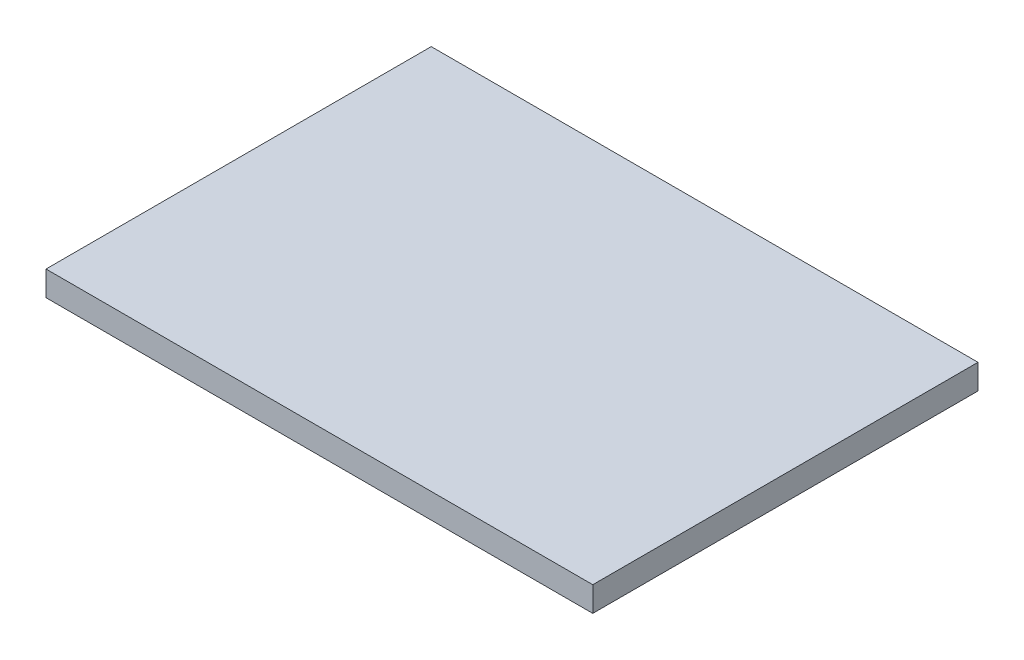
ISO-10303-21;
HEADER;
FILE_DESCRIPTION(('STEP AP214'),'2;1');
FILE_NAME('part.step','',(''),(''),'','','');
FILE_SCHEMA(('AUTOMOTIVE_DESIGN { 1 0 10303 214 1 1 1 1 }'));
ENDSEC;
DATA;
#1=APPLICATION_CONTEXT('core data for automotive mechanical design processes');
#2=APPLICATION_PROTOCOL_DEFINITION('international standard','automotive_design',2000,#1);
#3=PRODUCT_CONTEXT('',#1,'mechanical');
#4=PRODUCT('Part','Part','',(#3));
#5=PRODUCT_RELATED_PRODUCT_CATEGORY('part','',(#4));
#6=PRODUCT_DEFINITION_FORMATION('','',#4);
#7=PRODUCT_DEFINITION_CONTEXT('part definition',#1,'design');
#8=PRODUCT_DEFINITION('design','',#6,#7);
#9=PRODUCT_DEFINITION_SHAPE('','',#8);
#10=(LENGTH_UNIT() NAMED_UNIT(*) SI_UNIT(.MILLI.,.METRE.));
#11=(NAMED_UNIT(*) PLANE_ANGLE_UNIT() SI_UNIT($,.RADIAN.));
#12=(NAMED_UNIT(*) SI_UNIT($,.STERADIAN.) SOLID_ANGLE_UNIT());
#13=UNCERTAINTY_MEASURE_WITH_UNIT(LENGTH_MEASURE(1.E-05),#10,'distance_accuracy_value','');
#14=(GEOMETRIC_REPRESENTATION_CONTEXT(3) GLOBAL_UNCERTAINTY_ASSIGNED_CONTEXT((#13)) GLOBAL_UNIT_ASSIGNED_CONTEXT((#10,
#11,#12)) REPRESENTATION_CONTEXT('',''));
#15=CARTESIAN_POINT('',(0.,0.,0.));
#16=DIRECTION('',(0.,0.,1.));
#17=DIRECTION('',(1.,0.,0.));
#18=AXIS2_PLACEMENT_3D('',#15,#16,#17);
#19=CARTESIAN_POINT('',(0.,1.,0.));
#20=DIRECTION('',(1.,0.,0.));
#21=DIRECTION('',(0.,0.,-1.));
#22=AXIS2_PLACEMENT_3D('',#19,#20,#21);
#23=PLANE('',#22);
#24=DIRECTION('',(0.,-1.,0.));
#25=VECTOR('',#24,1.);
#26=CARTESIAN_POINT('',(0.,1.,15.5));
#27=LINE('',#26,#25);
#28=CARTESIAN_POINT('',(0.,1.,15.5));
#29=VERTEX_POINT('',#28);
#30=CARTESIAN_POINT('',(0.,0.,15.5));
#31=VERTEX_POINT('',#30);
#32=EDGE_CURVE('E77',#29,#31,#27,.T.);
#33=ORIENTED_EDGE('',*,*,#32,.F.);
#34=DIRECTION('',(0.,0.,-1.));
#35=VECTOR('',#34,1.);
#36=CARTESIAN_POINT('',(0.,1.,0.));
#37=LINE('',#36,#35);
#38=CARTESIAN_POINT('',(0.,1.,0.));
#39=VERTEX_POINT('',#38);
#40=EDGE_CURVE('E11',#29,#39,#37,.T.);
#41=ORIENTED_EDGE('',*,*,#40,.T.);
#42=DIRECTION('',(0.,-1.,0.));
#43=VECTOR('',#42,1.);
#44=CARTESIAN_POINT('',(0.,1.,0.));
#45=LINE('',#44,#43);
#46=CARTESIAN_POINT('',(0.,0.,0.));
#47=VERTEX_POINT('',#46);
#48=EDGE_CURVE('E95',#39,#47,#45,.T.);
#49=ORIENTED_EDGE('',*,*,#48,.T.);
#50=DIRECTION('',(0.,0.,1.));
#51=VECTOR('',#50,1.);
#52=CARTESIAN_POINT('',(0.,0.,0.));
#53=LINE('',#52,#51);
#54=EDGE_CURVE('E90',#47,#31,#53,.T.);
#55=ORIENTED_EDGE('',*,*,#54,.T.);
#56=EDGE_LOOP('',(#33,#41,#49,#55));
#57=FACE_BOUND('',#56,.T.);
#58=ADVANCED_FACE('F38',(#57),#23,.F.);
#59=CARTESIAN_POINT('',(0.,1.,15.5));
#60=DIRECTION('',(0.,0.,-1.));
#61=DIRECTION('',(-1.,0.,0.));
#62=AXIS2_PLACEMENT_3D('',#59,#60,#61);
#63=PLANE('',#62);
#64=DIRECTION('',(0.,-1.,0.));
#65=VECTOR('',#64,1.);
#66=CARTESIAN_POINT('',(22.,1.,15.5));
#67=LINE('',#66,#65);
#68=CARTESIAN_POINT('',(22.,1.,15.5));
#69=VERTEX_POINT('',#68);
#70=CARTESIAN_POINT('',(22.,0.,15.5));
#71=VERTEX_POINT('',#70);
#72=EDGE_CURVE('E84',#69,#71,#67,.T.);
#73=ORIENTED_EDGE('',*,*,#72,.F.);
#74=DIRECTION('',(-1.,0.,0.));
#75=VECTOR('',#74,1.);
#76=CARTESIAN_POINT('',(0.,1.,15.5));
#77=LINE('',#76,#75);
#78=EDGE_CURVE('E45',#69,#29,#77,.T.);
#79=ORIENTED_EDGE('',*,*,#78,.T.);
#80=ORIENTED_EDGE('',*,*,#32,.T.);
#81=DIRECTION('',(1.,0.,0.));
#82=VECTOR('',#81,1.);
#83=CARTESIAN_POINT('',(0.,0.,15.5));
#84=LINE('',#83,#82);
#85=EDGE_CURVE('E80',#31,#71,#84,.T.);
#86=ORIENTED_EDGE('',*,*,#85,.T.);
#87=EDGE_LOOP('',(#73,#79,#80,#86));
#88=FACE_BOUND('',#87,.T.);
#89=ADVANCED_FACE('F79',(#88),#63,.F.);
#90=CARTESIAN_POINT('',(22.,1.,0.));
#91=DIRECTION('',(-1.,0.,0.));
#92=DIRECTION('',(0.,0.,1.));
#93=AXIS2_PLACEMENT_3D('',#90,#91,#92);
#94=PLANE('',#93);
#95=DIRECTION('',(0.,-1.,0.));
#96=VECTOR('',#95,1.);
#97=CARTESIAN_POINT('',(22.,1.,0.));
#98=LINE('',#97,#96);
#99=CARTESIAN_POINT('',(22.,1.,0.));
#100=VERTEX_POINT('',#99);
#101=CARTESIAN_POINT('',(22.,0.,0.));
#102=VERTEX_POINT('',#101);
#103=EDGE_CURVE('E105',#100,#102,#98,.T.);
#104=ORIENTED_EDGE('',*,*,#103,.F.);
#105=DIRECTION('',(0.,0.,1.));
#106=VECTOR('',#105,1.);
#107=CARTESIAN_POINT('',(22.,1.,0.));
#108=LINE('',#107,#106);
#109=EDGE_CURVE('E59',#100,#69,#108,.T.);
#110=ORIENTED_EDGE('',*,*,#109,.T.);
#111=ORIENTED_EDGE('',*,*,#72,.T.);
#112=DIRECTION('',(0.,0.,-1.));
#113=VECTOR('',#112,1.);
#114=CARTESIAN_POINT('',(22.,0.,0.));
#115=LINE('',#114,#113);
#116=EDGE_CURVE('E92',#71,#102,#115,.T.);
#117=ORIENTED_EDGE('',*,*,#116,.T.);
#118=EDGE_LOOP('',(#104,#110,#111,#117));
#119=FACE_BOUND('',#118,.T.);
#120=ADVANCED_FACE('F108',(#119),#94,.F.);
#121=CARTESIAN_POINT('',(0.,1.,0.));
#122=DIRECTION('',(0.,0.,1.));
#123=DIRECTION('',(1.,0.,0.));
#124=AXIS2_PLACEMENT_3D('',#121,#122,#123);
#125=PLANE('',#124);
#126=ORIENTED_EDGE('',*,*,#48,.F.);
#127=DIRECTION('',(-1.,0.,0.));
#128=VECTOR('',#127,1.);
#129=CARTESIAN_POINT('',(0.,1.,0.));
#130=LINE('',#129,#128);
#131=EDGE_CURVE('E99',#100,#39,#130,.T.);
#132=ORIENTED_EDGE('',*,*,#131,.F.);
#133=ORIENTED_EDGE('',*,*,#103,.T.);
#134=DIRECTION('',(-1.,0.,0.));
#135=VECTOR('',#134,1.);
#136=CARTESIAN_POINT('',(0.,0.,0.));
#137=LINE('',#136,#135);
#138=EDGE_CURVE('E102',#102,#47,#137,.T.);
#139=ORIENTED_EDGE('',*,*,#138,.T.);
#140=EDGE_LOOP('',(#126,#132,#133,#139));
#141=FACE_BOUND('',#140,.T.);
#142=ADVANCED_FACE('F110',(#141),#125,.F.);
#143=CARTESIAN_POINT('',(0.,0.,0.));
#144=DIRECTION('',(0.,1.,0.));
#145=DIRECTION('',(0.,0.,1.));
#146=AXIS2_PLACEMENT_3D('',#143,#144,#145);
#147=PLANE('',#146);
#148=ORIENTED_EDGE('',*,*,#54,.F.);
#149=ORIENTED_EDGE('',*,*,#138,.F.);
#150=ORIENTED_EDGE('',*,*,#116,.F.);
#151=ORIENTED_EDGE('',*,*,#85,.F.);
#152=EDGE_LOOP('',(#148,#149,#150,#151));
#153=FACE_BOUND('',#152,.T.);
#154=ADVANCED_FACE('F88',(#153),#147,.F.);
#155=CARTESIAN_POINT('',(0.,1.,0.));
#156=DIRECTION('',(0.,1.,0.));
#157=DIRECTION('',(0.,0.,1.));
#158=AXIS2_PLACEMENT_3D('',#155,#156,#157);
#159=PLANE('',#158);
#160=ORIENTED_EDGE('',*,*,#131,.T.);
#161=ORIENTED_EDGE('',*,*,#40,.F.);
#162=ORIENTED_EDGE('',*,*,#78,.F.);
#163=ORIENTED_EDGE('',*,*,#109,.F.);
#164=EDGE_LOOP('',(#160,#161,#162,#163));
#165=FACE_BOUND('',#164,.T.);
#166=ADVANCED_FACE('F112',(#165),#159,.T.);
#167=CLOSED_SHELL('',(#58,#89,#120,#142,#154,#166));
#168=MANIFOLD_SOLID_BREP('B2',#167);
#169=ADVANCED_BREP_SHAPE_REPRESENTATION('',(#18,#168),#14);
#170=SHAPE_DEFINITION_REPRESENTATION(#9,#169);
ENDSEC;
END-ISO-10303-21;
